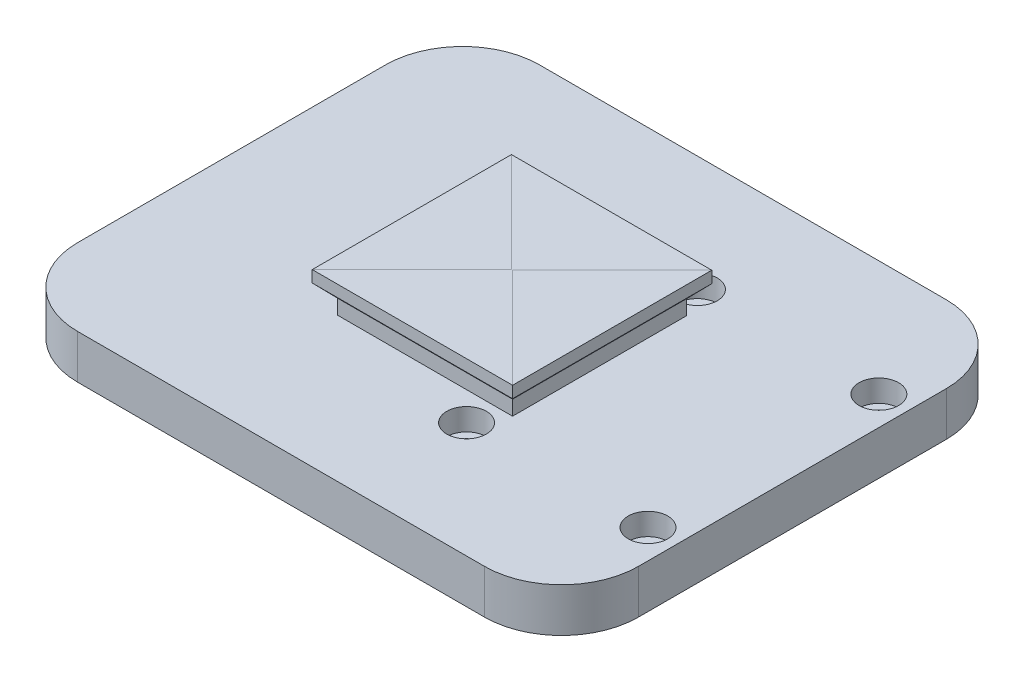
ISO-10303-21;
HEADER;
FILE_DESCRIPTION(('STEP AP214'),'2;1');
FILE_NAME('part.step','',(''),(''),'','','');
FILE_SCHEMA(('AUTOMOTIVE_DESIGN { 1 0 10303 214 1 1 1 1 }'));
ENDSEC;
DATA;
#1=APPLICATION_CONTEXT('core data for automotive mechanical design processes');
#2=APPLICATION_PROTOCOL_DEFINITION('international standard','automotive_design',2000,#1);
#3=PRODUCT_CONTEXT('',#1,'mechanical');
#4=PRODUCT('Part','Part','',(#3));
#5=PRODUCT_RELATED_PRODUCT_CATEGORY('part','',(#4));
#6=PRODUCT_DEFINITION_FORMATION('','',#4);
#7=PRODUCT_DEFINITION_CONTEXT('part definition',#1,'design');
#8=PRODUCT_DEFINITION('design','',#6,#7);
#9=PRODUCT_DEFINITION_SHAPE('','',#8);
#10=(LENGTH_UNIT() NAMED_UNIT(*) SI_UNIT(.MILLI.,.METRE.));
#11=(NAMED_UNIT(*) PLANE_ANGLE_UNIT() SI_UNIT($,.RADIAN.));
#12=(NAMED_UNIT(*) SI_UNIT($,.STERADIAN.) SOLID_ANGLE_UNIT());
#13=UNCERTAINTY_MEASURE_WITH_UNIT(LENGTH_MEASURE(1.E-05),#10,'distance_accuracy_value','');
#14=(GEOMETRIC_REPRESENTATION_CONTEXT(3) GLOBAL_UNCERTAINTY_ASSIGNED_CONTEXT((#13)) GLOBAL_UNIT_ASSIGNED_CONTEXT((#10,
#11,#12)) REPRESENTATION_CONTEXT('',''));
#15=CARTESIAN_POINT('',(0.,0.,0.));
#16=DIRECTION('',(0.,0.,1.));
#17=DIRECTION('',(1.,0.,0.));
#18=AXIS2_PLACEMENT_3D('',#15,#16,#17);
#19=CARTESIAN_POINT('',(18.5,0.2,14.));
#20=DIRECTION('',(0.,-1.,0.));
#21=DIRECTION('',(1.,0.,0.));
#22=AXIS2_PLACEMENT_3D('',#19,#20,#21);
#23=CYLINDRICAL_SURFACE('',#22,7.);
#24=CARTESIAN_POINT('',(18.5,-3.8,14.));
#25=DIRECTION('',(0.,1.,0.));
#26=DIRECTION('',(-1.,0.,0.));
#27=AXIS2_PLACEMENT_3D('',#24,#25,#26);
#28=CIRCLE('',#27,7.);
#29=CARTESIAN_POINT('',(18.5,-3.8,21.));
#30=VERTEX_POINT('',#29);
#31=CARTESIAN_POINT('',(25.5,-3.8,14.));
#32=VERTEX_POINT('',#31);
#33=EDGE_CURVE('E256',#30,#32,#28,.T.);
#34=ORIENTED_EDGE('',*,*,#33,.T.);
#35=DIRECTION('',(0.,-1.,0.));
#36=VECTOR('',#35,1.);
#37=CARTESIAN_POINT('',(25.5,0.2,14.));
#38=LINE('',#37,#36);
#39=CARTESIAN_POINT('',(25.5,0.2,14.));
#40=VERTEX_POINT('',#39);
#41=EDGE_CURVE('E421',#40,#32,#38,.T.);
#42=ORIENTED_EDGE('',*,*,#41,.F.);
#43=CARTESIAN_POINT('',(18.5,0.2,14.));
#44=DIRECTION('',(0.,1.,0.));
#45=DIRECTION('',(-1.,0.,0.));
#46=AXIS2_PLACEMENT_3D('',#43,#44,#45);
#47=CIRCLE('',#46,7.);
#48=CARTESIAN_POINT('',(18.5,0.2,21.));
#49=VERTEX_POINT('',#48);
#50=EDGE_CURVE('E272',#49,#40,#47,.T.);
#51=ORIENTED_EDGE('',*,*,#50,.F.);
#52=DIRECTION('',(0.,-1.,0.));
#53=VECTOR('',#52,1.);
#54=CARTESIAN_POINT('',(18.5,0.2,21.));
#55=LINE('',#54,#53);
#56=EDGE_CURVE('E403',#49,#30,#55,.T.);
#57=ORIENTED_EDGE('',*,*,#56,.T.);
#58=EDGE_LOOP('',(#34,#42,#51,#57));
#59=FACE_BOUND('',#58,.T.);
#60=ADVANCED_FACE('F15',(#59),#23,.T.);
#61=CARTESIAN_POINT('',(7.95,1.540402622584,-9.274709182745));
#62=DIRECTION('',(-0.719339800338818,0.694658370458825,0.));
#63=DIRECTION('',(0.,0.,1.));
#64=AXIS2_PLACEMENT_3D('',#61,#62,#63);
#65=PLANE('',#64);
#66=DIRECTION('',(-0.570514335805256,-0.590784889178265,0.570514335805256));
#67=VECTOR('',#66,1.);
#68=CARTESIAN_POINT('',(9.108826529768,2.740402622584,-9.058826529768));
#69=LINE('',#68,#67);
#70=CARTESIAN_POINT('',(9.108826529768,2.740402622584,-9.058826529768));
#71=VERTEX_POINT('',#70);
#72=CARTESIAN_POINT('',(7.95,1.540402622584,-7.9));
#73=VERTEX_POINT('',#72);
#74=EDGE_CURVE('E396',#71,#73,#69,.T.);
#75=ORIENTED_EDGE('',*,*,#74,.F.);
#76=DIRECTION('',(0.,0.,1.));
#77=VECTOR('',#76,1.);
#78=CARTESIAN_POINT('',(9.108826529768,2.740402622584,-9.058826529768));
#79=LINE('',#78,#77);
#80=CARTESIAN_POINT('',(9.108826529768,2.740402622584,9.058826529768));
#81=VERTEX_POINT('',#80);
#82=EDGE_CURVE('E9',#71,#81,#79,.T.);
#83=ORIENTED_EDGE('',*,*,#82,.T.);
#84=DIRECTION('',(-0.570514335805256,-0.590784889178265,-0.570514335805256));
#85=VECTOR('',#84,1.);
#86=CARTESIAN_POINT('',(9.108826529768,2.740402622584,9.058826529768));
#87=LINE('',#86,#85);
#88=CARTESIAN_POINT('',(7.95,1.540402622584,7.9));
#89=VERTEX_POINT('',#88);
#90=EDGE_CURVE('E417',#81,#89,#87,.T.);
#91=ORIENTED_EDGE('',*,*,#90,.T.);
#92=DIRECTION('',(0.,0.,1.));
#93=VECTOR('',#92,1.);
#94=CARTESIAN_POINT('',(7.95,1.540402622584,-7.9));
#95=LINE('',#94,#93);
#96=EDGE_CURVE('E43',#73,#89,#95,.T.);
#97=ORIENTED_EDGE('',*,*,#96,.F.);
#98=EDGE_LOOP('',(#75,#83,#91,#97));
#99=FACE_BOUND('',#98,.T.);
#100=ADVANCED_FACE('F584',(#99),#65,.F.);
#101=CARTESIAN_POINT('',(9.108826529768,2.740402622584,-9.274709182745));
#102=DIRECTION('',(-1.,0.,0.));
#103=DIRECTION('',(0.,0.,1.));
#104=AXIS2_PLACEMENT_3D('',#101,#102,#103);
#105=PLANE('',#104);
#106=DIRECTION('',(0.,-1.,0.));
#107=VECTOR('',#106,1.);
#108=CARTESIAN_POINT('',(9.108826529768,3.8,-9.058826529768));
#109=LINE('',#108,#107);
#110=CARTESIAN_POINT('',(9.108826529768,3.8,-9.058826529768));
#111=VERTEX_POINT('',#110);
#112=EDGE_CURVE('E393',#111,#71,#109,.T.);
#113=ORIENTED_EDGE('',*,*,#112,.F.);
#114=DIRECTION('',(0.,0.,1.));
#115=VECTOR('',#114,1.);
#116=CARTESIAN_POINT('',(9.108826529768,3.8,-9.058826529768));
#117=LINE('',#116,#115);
#118=CARTESIAN_POINT('',(9.108826529768,3.8,9.058826529768));
#119=VERTEX_POINT('',#118);
#120=EDGE_CURVE('E23',#111,#119,#117,.T.);
#121=ORIENTED_EDGE('',*,*,#120,.T.);
#122=DIRECTION('',(0.,-1.,0.));
#123=VECTOR('',#122,1.);
#124=CARTESIAN_POINT('',(9.108826529768,3.8,9.058826529768));
#125=LINE('',#124,#123);
#126=EDGE_CURVE('E352',#119,#81,#125,.T.);
#127=ORIENTED_EDGE('',*,*,#126,.T.);
#128=ORIENTED_EDGE('',*,*,#82,.F.);
#129=EDGE_LOOP('',(#113,#121,#127,#128));
#130=FACE_BOUND('',#129,.T.);
#131=ADVANCED_FACE('F583',(#130),#105,.F.);
#132=CARTESIAN_POINT('',(9.108826529768,3.8,-9.274709182745));
#133=DIRECTION('',(0.,-1.,0.));
#134=DIRECTION('',(0.,0.,-1.));
#135=AXIS2_PLACEMENT_3D('',#132,#133,#134);
#136=PLANE('',#135);
#137=DIRECTION('',(0.707106781186548,0.,-0.707106781186548));
#138=VECTOR('',#137,1.);
#139=CARTESIAN_POINT('',(0.05,3.8,0.));
#140=LINE('',#139,#138);
#141=CARTESIAN_POINT('',(0.05,3.8,0.));
#142=VERTEX_POINT('',#141);
#143=EDGE_CURVE('E390',#142,#111,#140,.T.);
#144=ORIENTED_EDGE('',*,*,#143,.F.);
#145=DIRECTION('',(0.707106781186548,0.,0.707106781186548));
#146=VECTOR('',#145,1.);
#147=CARTESIAN_POINT('',(0.05,3.8,0.));
#148=LINE('',#147,#146);
#149=EDGE_CURVE('E382',#142,#119,#148,.T.);
#150=ORIENTED_EDGE('',*,*,#149,.T.);
#151=ORIENTED_EDGE('',*,*,#120,.F.);
#152=EDGE_LOOP('',(#144,#150,#151));
#153=FACE_BOUND('',#152,.T.);
#154=ADVANCED_FACE('F571',(#153),#136,.F.);
#155=CARTESIAN_POINT('',(7.95,0.2,-9.274709182745));
#156=DIRECTION('',(-1.,0.,0.));
#157=DIRECTION('',(0.,0.,1.));
#158=AXIS2_PLACEMENT_3D('',#155,#156,#157);
#159=PLANE('',#158);
#160=DIRECTION('',(0.,-1.,0.));
#161=VECTOR('',#160,1.);
#162=CARTESIAN_POINT('',(7.95,1.540402622584,-7.9));
#163=LINE('',#162,#161);
#164=CARTESIAN_POINT('',(7.95,0.2,-7.9));
#165=VERTEX_POINT('',#164);
#166=EDGE_CURVE('E309',#73,#165,#163,.T.);
#167=ORIENTED_EDGE('',*,*,#166,.F.);
#168=ORIENTED_EDGE('',*,*,#96,.T.);
#169=DIRECTION('',(0.,-1.,0.));
#170=VECTOR('',#169,1.);
#171=CARTESIAN_POINT('',(7.95,1.540402622584,7.9));
#172=LINE('',#171,#170);
#173=CARTESIAN_POINT('',(7.95,0.2,7.9));
#174=VERTEX_POINT('',#173);
#175=EDGE_CURVE('E353',#89,#174,#172,.T.);
#176=ORIENTED_EDGE('',*,*,#175,.T.);
#177=DIRECTION('',(0.,0.,1.));
#178=VECTOR('',#177,1.);
#179=CARTESIAN_POINT('',(7.95,0.2,-7.9));
#180=LINE('',#179,#178);
#181=EDGE_CURVE('E294',#165,#174,#180,.T.);
#182=ORIENTED_EDGE('',*,*,#181,.F.);
#183=EDGE_LOOP('',(#167,#168,#176,#182));
#184=FACE_BOUND('',#183,.T.);
#185=ADVANCED_FACE('F568',(#184),#159,.F.);
#186=CARTESIAN_POINT('',(25.5,0.2,0.));
#187=DIRECTION('',(-1.,0.,0.));
#188=DIRECTION('',(0.,0.,1.));
#189=AXIS2_PLACEMENT_3D('',#186,#187,#188);
#190=PLANE('',#189);
#191=DIRECTION('',(0.,0.,1.));
#192=VECTOR('',#191,1.);
#193=CARTESIAN_POINT('',(25.5,-3.8,-14.));
#194=LINE('',#193,#192);
#195=CARTESIAN_POINT('',(25.5,-3.8,-14.));
#196=VERTEX_POINT('',#195);
#197=EDGE_CURVE('E255',#196,#32,#194,.T.);
#198=ORIENTED_EDGE('',*,*,#197,.F.);
#199=DIRECTION('',(0.,-1.,0.));
#200=VECTOR('',#199,1.);
#201=CARTESIAN_POINT('',(25.5,0.2,-14.));
#202=LINE('',#201,#200);
#203=CARTESIAN_POINT('',(25.5,0.2,-14.));
#204=VERTEX_POINT('',#203);
#205=EDGE_CURVE('E419',#204,#196,#202,.T.);
#206=ORIENTED_EDGE('',*,*,#205,.F.);
#207=DIRECTION('',(0.,0.,1.));
#208=VECTOR('',#207,1.);
#209=CARTESIAN_POINT('',(25.5,0.2,-14.));
#210=LINE('',#209,#208);
#211=EDGE_CURVE('E280',#204,#40,#210,.T.);
#212=ORIENTED_EDGE('',*,*,#211,.T.);
#213=ORIENTED_EDGE('',*,*,#41,.T.);
#214=EDGE_LOOP('',(#198,#206,#212,#213));
#215=FACE_BOUND('',#214,.T.);
#216=ADVANCED_FACE('F569',(#215),#190,.F.);
#217=CARTESIAN_POINT('',(18.5,0.2,-14.));
#218=DIRECTION('',(0.,-1.,0.));
#219=DIRECTION('',(1.,0.,0.));
#220=AXIS2_PLACEMENT_3D('',#217,#218,#219);
#221=CYLINDRICAL_SURFACE('',#220,7.);
#222=CARTESIAN_POINT('',(18.5,-3.8,-14.));
#223=DIRECTION('',(0.,-1.,0.));
#224=DIRECTION('',(-1.,0.,0.));
#225=AXIS2_PLACEMENT_3D('',#222,#223,#224);
#226=CIRCLE('',#225,7.);
#227=CARTESIAN_POINT('',(18.5,-3.8,-21.));
#228=VERTEX_POINT('',#227);
#229=EDGE_CURVE('E259',#228,#196,#226,.T.);
#230=ORIENTED_EDGE('',*,*,#229,.F.);
#231=DIRECTION('',(0.,-1.,0.));
#232=VECTOR('',#231,1.);
#233=CARTESIAN_POINT('',(18.5,0.2,-21.));
#234=LINE('',#233,#232);
#235=CARTESIAN_POINT('',(18.5,0.2,-21.));
#236=VERTEX_POINT('',#235);
#237=EDGE_CURVE('E337',#236,#228,#234,.T.);
#238=ORIENTED_EDGE('',*,*,#237,.F.);
#239=CARTESIAN_POINT('',(18.5,0.2,-14.));
#240=DIRECTION('',(0.,-1.,0.));
#241=DIRECTION('',(-1.,0.,0.));
#242=AXIS2_PLACEMENT_3D('',#239,#240,#241);
#243=CIRCLE('',#242,7.);
#244=EDGE_CURVE('E241',#236,#204,#243,.T.);
#245=ORIENTED_EDGE('',*,*,#244,.T.);
#246=ORIENTED_EDGE('',*,*,#205,.T.);
#247=EDGE_LOOP('',(#230,#238,#245,#246));
#248=FACE_BOUND('',#247,.T.);
#249=ADVANCED_FACE('F578',(#248),#221,.T.);
#250=CARTESIAN_POINT('',(0.,1.540402622584,7.9));
#251=DIRECTION('',(0.,0.694658370458825,-0.719339800338818));
#252=DIRECTION('',(-1.,0.,0.));
#253=AXIS2_PLACEMENT_3D('',#250,#251,#252);
#254=PLANE('',#253);
#255=DIRECTION('',(-1.,0.,0.));
#256=VECTOR('',#255,1.);
#257=CARTESIAN_POINT('',(9.108826529768,2.740402622584,9.058826529768));
#258=LINE('',#257,#256);
#259=CARTESIAN_POINT('',(-9.108826529768,2.740402622584,9.058826529768));
#260=VERTEX_POINT('',#259);
#261=EDGE_CURVE('E349',#81,#260,#258,.T.);
#262=ORIENTED_EDGE('',*,*,#261,.T.);
#263=DIRECTION('',(0.570514335805256,-0.590784889178265,-0.570514335805256));
#264=VECTOR('',#263,1.);
#265=CARTESIAN_POINT('',(-9.108826529768,2.740402622584,9.058826529768));
#266=LINE('',#265,#264);
#267=CARTESIAN_POINT('',(-7.95,1.540402622584,7.9));
#268=VERTEX_POINT('',#267);
#269=EDGE_CURVE('E313',#260,#268,#266,.T.);
#270=ORIENTED_EDGE('',*,*,#269,.T.);
#271=DIRECTION('',(-1.,0.,0.));
#272=VECTOR('',#271,1.);
#273=CARTESIAN_POINT('',(7.95,1.540402622584,7.9));
#274=LINE('',#273,#272);
#275=EDGE_CURVE('E408',#89,#268,#274,.T.);
#276=ORIENTED_EDGE('',*,*,#275,.F.);
#277=ORIENTED_EDGE('',*,*,#90,.F.);
#278=EDGE_LOOP('',(#262,#270,#276,#277));
#279=FACE_BOUND('',#278,.T.);
#280=ADVANCED_FACE('F551',(#279),#254,.F.);
#281=CARTESIAN_POINT('',(0.,2.740402622584,9.058826529768));
#282=DIRECTION('',(0.,0.,-1.));
#283=DIRECTION('',(0.,-1.,0.));
#284=AXIS2_PLACEMENT_3D('',#281,#282,#283);
#285=PLANE('',#284);
#286=DIRECTION('',(-1.,0.,0.));
#287=VECTOR('',#286,1.);
#288=CARTESIAN_POINT('',(9.108826529768,3.8,9.058826529768));
#289=LINE('',#288,#287);
#290=CARTESIAN_POINT('',(-9.108826529768,3.8,9.058826529768));
#291=VERTEX_POINT('',#290);
#292=EDGE_CURVE('E379',#119,#291,#289,.T.);
#293=ORIENTED_EDGE('',*,*,#292,.T.);
#294=DIRECTION('',(0.,-1.,0.));
#295=VECTOR('',#294,1.);
#296=CARTESIAN_POINT('',(-9.108826529768,3.8,9.058826529768));
#297=LINE('',#296,#295);
#298=EDGE_CURVE('E373',#291,#260,#297,.T.);
#299=ORIENTED_EDGE('',*,*,#298,.T.);
#300=ORIENTED_EDGE('',*,*,#261,.F.);
#301=ORIENTED_EDGE('',*,*,#126,.F.);
#302=EDGE_LOOP('',(#293,#299,#300,#301));
#303=FACE_BOUND('',#302,.T.);
#304=ADVANCED_FACE('F559',(#303),#285,.F.);
#305=CARTESIAN_POINT('',(0.,0.2,7.9));
#306=DIRECTION('',(0.,0.,-1.));
#307=DIRECTION('',(0.,-1.,0.));
#308=AXIS2_PLACEMENT_3D('',#305,#306,#307);
#309=PLANE('',#308);
#310=ORIENTED_EDGE('',*,*,#275,.T.);
#311=DIRECTION('',(0.,-1.,0.));
#312=VECTOR('',#311,1.);
#313=CARTESIAN_POINT('',(-7.95,1.540402622584,7.9));
#314=LINE('',#313,#312);
#315=CARTESIAN_POINT('',(-7.95,0.2,7.9));
#316=VERTEX_POINT('',#315);
#317=EDGE_CURVE('E346',#268,#316,#314,.T.);
#318=ORIENTED_EDGE('',*,*,#317,.T.);
#319=DIRECTION('',(-1.,0.,0.));
#320=VECTOR('',#319,1.);
#321=CARTESIAN_POINT('',(7.95,0.2,7.9));
#322=LINE('',#321,#320);
#323=EDGE_CURVE('E298',#174,#316,#322,.T.);
#324=ORIENTED_EDGE('',*,*,#323,.F.);
#325=ORIENTED_EDGE('',*,*,#175,.F.);
#326=EDGE_LOOP('',(#310,#318,#324,#325));
#327=FACE_BOUND('',#326,.T.);
#328=ADVANCED_FACE('F552',(#327),#309,.F.);
#329=CARTESIAN_POINT('',(-18.5,0.2,14.));
#330=DIRECTION('',(0.,-1.,0.));
#331=DIRECTION('',(-1.,0.,0.));
#332=AXIS2_PLACEMENT_3D('',#329,#330,#331);
#333=CYLINDRICAL_SURFACE('',#332,7.);
#334=CARTESIAN_POINT('',(-18.5,-3.8,14.));
#335=DIRECTION('',(0.,-1.,0.));
#336=DIRECTION('',(1.,0.,0.));
#337=AXIS2_PLACEMENT_3D('',#334,#335,#336);
#338=CIRCLE('',#337,7.);
#339=CARTESIAN_POINT('',(-18.5,-3.8,21.));
#340=VERTEX_POINT('',#339);
#341=CARTESIAN_POINT('',(-25.5,-3.8,14.));
#342=VERTEX_POINT('',#341);
#343=EDGE_CURVE('E325',#340,#342,#338,.T.);
#344=ORIENTED_EDGE('',*,*,#343,.F.);
#345=DIRECTION('',(0.,-1.,0.));
#346=VECTOR('',#345,1.);
#347=CARTESIAN_POINT('',(-18.5,0.2,21.));
#348=LINE('',#347,#346);
#349=CARTESIAN_POINT('',(-18.5,0.2,21.));
#350=VERTEX_POINT('',#349);
#351=EDGE_CURVE('E406',#350,#340,#348,.T.);
#352=ORIENTED_EDGE('',*,*,#351,.F.);
#353=CARTESIAN_POINT('',(-18.5,0.2,14.));
#354=DIRECTION('',(0.,-1.,0.));
#355=DIRECTION('',(1.,0.,0.));
#356=AXIS2_PLACEMENT_3D('',#353,#354,#355);
#357=CIRCLE('',#356,7.);
#358=CARTESIAN_POINT('',(-25.5,0.2,14.));
#359=VERTEX_POINT('',#358);
#360=EDGE_CURVE('E268',#350,#359,#357,.T.);
#361=ORIENTED_EDGE('',*,*,#360,.T.);
#362=DIRECTION('',(0.,-1.,0.));
#363=VECTOR('',#362,1.);
#364=CARTESIAN_POINT('',(-25.5,0.2,14.));
#365=LINE('',#364,#363);
#366=EDGE_CURVE('E344',#359,#342,#365,.T.);
#367=ORIENTED_EDGE('',*,*,#366,.T.);
#368=EDGE_LOOP('',(#344,#352,#361,#367));
#369=FACE_BOUND('',#368,.T.);
#370=ADVANCED_FACE('F606',(#369),#333,.T.);
#371=CARTESIAN_POINT('',(0.,0.2,21.));
#372=DIRECTION('',(0.,0.,-1.));
#373=DIRECTION('',(0.,-1.,0.));
#374=AXIS2_PLACEMENT_3D('',#371,#372,#373);
#375=PLANE('',#374);
#376=DIRECTION('',(-1.,0.,0.));
#377=VECTOR('',#376,1.);
#378=CARTESIAN_POINT('',(18.5,-3.8,21.));
#379=LINE('',#378,#377);
#380=EDGE_CURVE('E318',#30,#340,#379,.T.);
#381=ORIENTED_EDGE('',*,*,#380,.F.);
#382=ORIENTED_EDGE('',*,*,#56,.F.);
#383=DIRECTION('',(-1.,0.,0.));
#384=VECTOR('',#383,1.);
#385=CARTESIAN_POINT('',(18.5,0.2,21.));
#386=LINE('',#385,#384);
#387=EDGE_CURVE('E267',#49,#350,#386,.T.);
#388=ORIENTED_EDGE('',*,*,#387,.T.);
#389=ORIENTED_EDGE('',*,*,#351,.T.);
#390=EDGE_LOOP('',(#381,#382,#388,#389));
#391=FACE_BOUND('',#390,.T.);
#392=ADVANCED_FACE('F603',(#391),#375,.F.);
#393=CARTESIAN_POINT('',(0.,1.540402622584,-7.9));
#394=DIRECTION('',(0.,0.694658370458825,0.719339800338818));
#395=DIRECTION('',(1.,0.,0.));
#396=AXIS2_PLACEMENT_3D('',#393,#394,#395);
#397=PLANE('',#396);
#398=DIRECTION('',(-1.,0.,0.));
#399=VECTOR('',#398,1.);
#400=CARTESIAN_POINT('',(9.108826529768,2.740402622584,-9.058826529768));
#401=LINE('',#400,#399);
#402=CARTESIAN_POINT('',(-9.108826529768,2.740402622584,-9.058826529768));
#403=VERTEX_POINT('',#402);
#404=EDGE_CURVE('E399',#71,#403,#401,.T.);
#405=ORIENTED_EDGE('',*,*,#404,.F.);
#406=ORIENTED_EDGE('',*,*,#74,.T.);
#407=DIRECTION('',(-1.,0.,0.));
#408=VECTOR('',#407,1.);
#409=CARTESIAN_POINT('',(7.95,1.540402622584,-7.9));
#410=LINE('',#409,#408);
#411=CARTESIAN_POINT('',(-7.95,1.540402622584,-7.9));
#412=VERTEX_POINT('',#411);
#413=EDGE_CURVE('E307',#73,#412,#410,.T.);
#414=ORIENTED_EDGE('',*,*,#413,.T.);
#415=DIRECTION('',(0.570514335805256,-0.590784889178265,0.570514335805256));
#416=VECTOR('',#415,1.);
#417=CARTESIAN_POINT('',(-9.108826529768,2.740402622584,-9.058826529768));
#418=LINE('',#417,#416);
#419=EDGE_CURVE('E380',#403,#412,#418,.T.);
#420=ORIENTED_EDGE('',*,*,#419,.F.);
#421=EDGE_LOOP('',(#405,#406,#414,#420));
#422=FACE_BOUND('',#421,.T.);
#423=ADVANCED_FACE('F566',(#422),#397,.F.);
#424=CARTESIAN_POINT('',(0.,2.740402622584,-9.058826529768));
#425=DIRECTION('',(0.,0.,1.));
#426=DIRECTION('',(1.,0.,0.));
#427=AXIS2_PLACEMENT_3D('',#424,#425,#426);
#428=PLANE('',#427);
#429=DIRECTION('',(-1.,0.,0.));
#430=VECTOR('',#429,1.);
#431=CARTESIAN_POINT('',(9.108826529768,3.8,-9.058826529768));
#432=LINE('',#431,#430);
#433=CARTESIAN_POINT('',(-9.108826529768,3.8,-9.058826529768));
#434=VERTEX_POINT('',#433);
#435=EDGE_CURVE('E391',#111,#434,#432,.T.);
#436=ORIENTED_EDGE('',*,*,#435,.F.);
#437=ORIENTED_EDGE('',*,*,#112,.T.);
#438=ORIENTED_EDGE('',*,*,#404,.T.);
#439=DIRECTION('',(0.,-1.,0.));
#440=VECTOR('',#439,1.);
#441=CARTESIAN_POINT('',(-9.108826529768,3.8,-9.058826529768));
#442=LINE('',#441,#440);
#443=EDGE_CURVE('E364',#434,#403,#442,.T.);
#444=ORIENTED_EDGE('',*,*,#443,.F.);
#445=EDGE_LOOP('',(#436,#437,#438,#444));
#446=FACE_BOUND('',#445,.T.);
#447=ADVANCED_FACE('F570',(#446),#428,.F.);
#448=CARTESIAN_POINT('',(0.,3.8,-9.058826529768));
#449=DIRECTION('',(0.,-1.,0.));
#450=DIRECTION('',(0.,0.,-1.));
#451=AXIS2_PLACEMENT_3D('',#448,#449,#450);
#452=PLANE('',#451);
#453=DIRECTION('',(-0.707106781186548,0.,-0.707106781186548));
#454=VECTOR('',#453,1.);
#455=CARTESIAN_POINT('',(-0.05,3.8,0.));
#456=LINE('',#455,#454);
#457=CARTESIAN_POINT('',(-0.05,3.8,0.));
#458=VERTEX_POINT('',#457);
#459=EDGE_CURVE('E282',#458,#434,#456,.T.);
#460=ORIENTED_EDGE('',*,*,#459,.F.);
#461=DIRECTION('',(-0.707106781186548,0.,0.707106781186548));
#462=VECTOR('',#461,1.);
#463=CARTESIAN_POINT('',(-0.05,3.8,0.));
#464=LINE('',#463,#462);
#465=EDGE_CURVE('E363',#458,#291,#464,.T.);
#466=ORIENTED_EDGE('',*,*,#465,.T.);
#467=ORIENTED_EDGE('',*,*,#292,.F.);
#468=ORIENTED_EDGE('',*,*,#149,.F.);
#469=ORIENTED_EDGE('',*,*,#143,.T.);
#470=ORIENTED_EDGE('',*,*,#435,.T.);
#471=EDGE_LOOP('',(#460,#466,#467,#468,#469,#470));
#472=FACE_BOUND('',#471,.T.);
#473=ADVANCED_FACE('F676',(#472),#452,.F.);
#474=CARTESIAN_POINT('',(0.,0.2,-7.9));
#475=DIRECTION('',(0.,0.,1.));
#476=DIRECTION('',(1.,0.,0.));
#477=AXIS2_PLACEMENT_3D('',#474,#475,#476);
#478=PLANE('',#477);
#479=ORIENTED_EDGE('',*,*,#413,.F.);
#480=ORIENTED_EDGE('',*,*,#166,.T.);
#481=DIRECTION('',(-1.,0.,0.));
#482=VECTOR('',#481,1.);
#483=CARTESIAN_POINT('',(7.95,0.2,-7.9));
#484=LINE('',#483,#482);
#485=CARTESIAN_POINT('',(-7.95,0.2,-7.9));
#486=VERTEX_POINT('',#485);
#487=EDGE_CURVE('E295',#165,#486,#484,.T.);
#488=ORIENTED_EDGE('',*,*,#487,.T.);
#489=DIRECTION('',(0.,-1.,0.));
#490=VECTOR('',#489,1.);
#491=CARTESIAN_POINT('',(-7.95,1.540402622584,-7.9));
#492=LINE('',#491,#490);
#493=EDGE_CURVE('E350',#412,#486,#492,.T.);
#494=ORIENTED_EDGE('',*,*,#493,.F.);
#495=EDGE_LOOP('',(#479,#480,#488,#494));
#496=FACE_BOUND('',#495,.T.);
#497=ADVANCED_FACE('F543',(#496),#478,.F.);
#498=CARTESIAN_POINT('',(-7.95,1.540402622584,-9.274709182745));
#499=DIRECTION('',(0.719339800338818,0.694658370458825,0.));
#500=DIRECTION('',(0.,0.,-1.));
#501=AXIS2_PLACEMENT_3D('',#498,#499,#500);
#502=PLANE('',#501);
#503=ORIENTED_EDGE('',*,*,#419,.T.);
#504=DIRECTION('',(0.,0.,1.));
#505=VECTOR('',#504,1.);
#506=CARTESIAN_POINT('',(-7.95,1.540402622584,-7.9));
#507=LINE('',#506,#505);
#508=EDGE_CURVE('E290',#412,#268,#507,.T.);
#509=ORIENTED_EDGE('',*,*,#508,.T.);
#510=ORIENTED_EDGE('',*,*,#269,.F.);
#511=DIRECTION('',(0.,0.,1.));
#512=VECTOR('',#511,1.);
#513=CARTESIAN_POINT('',(-9.108826529768,2.740402622584,-9.058826529768));
#514=LINE('',#513,#512);
#515=EDGE_CURVE('E369',#403,#260,#514,.T.);
#516=ORIENTED_EDGE('',*,*,#515,.F.);
#517=EDGE_LOOP('',(#503,#509,#510,#516));
#518=FACE_BOUND('',#517,.T.);
#519=ADVANCED_FACE('F531',(#518),#502,.F.);
#520=CARTESIAN_POINT('',(-9.108826529768,2.740402622584,-9.274709182745));
#521=DIRECTION('',(1.,0.,0.));
#522=DIRECTION('',(0.,0.,-1.));
#523=AXIS2_PLACEMENT_3D('',#520,#521,#522);
#524=PLANE('',#523);
#525=ORIENTED_EDGE('',*,*,#443,.T.);
#526=ORIENTED_EDGE('',*,*,#515,.T.);
#527=ORIENTED_EDGE('',*,*,#298,.F.);
#528=DIRECTION('',(0.,0.,1.));
#529=VECTOR('',#528,1.);
#530=CARTESIAN_POINT('',(-9.108826529768,3.8,-9.058826529768));
#531=LINE('',#530,#529);
#532=EDGE_CURVE('E287',#434,#291,#531,.T.);
#533=ORIENTED_EDGE('',*,*,#532,.F.);
#534=EDGE_LOOP('',(#525,#526,#527,#533));
#535=FACE_BOUND('',#534,.T.);
#536=ADVANCED_FACE('F565',(#535),#524,.F.);
#537=CARTESIAN_POINT('',(-9.108826529768,3.8,-9.274709182745));
#538=DIRECTION('',(0.,-1.,0.));
#539=DIRECTION('',(0.,0.,-1.));
#540=AXIS2_PLACEMENT_3D('',#537,#538,#539);
#541=PLANE('',#540);
#542=ORIENTED_EDGE('',*,*,#459,.T.);
#543=ORIENTED_EDGE('',*,*,#532,.T.);
#544=ORIENTED_EDGE('',*,*,#465,.F.);
#545=EDGE_LOOP('',(#542,#543,#544));
#546=FACE_BOUND('',#545,.T.);
#547=ADVANCED_FACE('F667',(#546),#541,.F.);
#548=CARTESIAN_POINT('',(-7.95,0.2,-9.274709182745));
#549=DIRECTION('',(1.,0.,0.));
#550=DIRECTION('',(0.,0.,-1.));
#551=AXIS2_PLACEMENT_3D('',#548,#549,#550);
#552=PLANE('',#551);
#553=ORIENTED_EDGE('',*,*,#493,.T.);
#554=DIRECTION('',(0.,0.,1.));
#555=VECTOR('',#554,1.);
#556=CARTESIAN_POINT('',(-7.95,0.2,-7.9));
#557=LINE('',#556,#555);
#558=EDGE_CURVE('E281',#486,#316,#557,.T.);
#559=ORIENTED_EDGE('',*,*,#558,.T.);
#560=ORIENTED_EDGE('',*,*,#317,.F.);
#561=ORIENTED_EDGE('',*,*,#508,.F.);
#562=EDGE_LOOP('',(#553,#559,#560,#561));
#563=FACE_BOUND('',#562,.T.);
#564=ADVANCED_FACE('F539',(#563),#552,.F.);
#565=CARTESIAN_POINT('',(-25.5,0.2,0.));
#566=DIRECTION('',(1.,0.,0.));
#567=DIRECTION('',(0.,1.,0.));
#568=AXIS2_PLACEMENT_3D('',#565,#566,#567);
#569=PLANE('',#568);
#570=DIRECTION('',(0.,0.,1.));
#571=VECTOR('',#570,1.);
#572=CARTESIAN_POINT('',(-25.5,-3.8,-14.));
#573=LINE('',#572,#571);
#574=CARTESIAN_POINT('',(-25.5,-3.8,-14.));
#575=VERTEX_POINT('',#574);
#576=EDGE_CURVE('E326',#575,#342,#573,.T.);
#577=ORIENTED_EDGE('',*,*,#576,.T.);
#578=ORIENTED_EDGE('',*,*,#366,.F.);
#579=DIRECTION('',(0.,0.,1.));
#580=VECTOR('',#579,1.);
#581=CARTESIAN_POINT('',(-25.5,0.2,-14.));
#582=LINE('',#581,#580);
#583=CARTESIAN_POINT('',(-25.5,0.2,-14.));
#584=VERTEX_POINT('',#583);
#585=EDGE_CURVE('E262',#584,#359,#582,.T.);
#586=ORIENTED_EDGE('',*,*,#585,.F.);
#587=DIRECTION('',(0.,-1.,0.));
#588=VECTOR('',#587,1.);
#589=CARTESIAN_POINT('',(-25.5,0.2,-14.));
#590=LINE('',#589,#588);
#591=EDGE_CURVE('E340',#584,#575,#590,.T.);
#592=ORIENTED_EDGE('',*,*,#591,.T.);
#593=EDGE_LOOP('',(#577,#578,#586,#592));
#594=FACE_BOUND('',#593,.T.);
#595=ADVANCED_FACE('F612',(#594),#569,.F.);
#596=CARTESIAN_POINT('',(-18.5,0.2,-14.));
#597=DIRECTION('',(0.,-1.,0.));
#598=DIRECTION('',(-1.,0.,0.));
#599=AXIS2_PLACEMENT_3D('',#596,#597,#598);
#600=CYLINDRICAL_SURFACE('',#599,7.);
#601=CARTESIAN_POINT('',(-18.5,-3.8,-14.));
#602=DIRECTION('',(0.,1.,0.));
#603=DIRECTION('',(1.,0.,0.));
#604=AXIS2_PLACEMENT_3D('',#601,#602,#603);
#605=CIRCLE('',#604,7.);
#606=CARTESIAN_POINT('',(-18.5,-3.8,-21.));
#607=VERTEX_POINT('',#606);
#608=EDGE_CURVE('E329',#607,#575,#605,.T.);
#609=ORIENTED_EDGE('',*,*,#608,.T.);
#610=ORIENTED_EDGE('',*,*,#591,.F.);
#611=CARTESIAN_POINT('',(-18.5,0.2,-14.));
#612=DIRECTION('',(0.,1.,0.));
#613=DIRECTION('',(1.,0.,0.));
#614=AXIS2_PLACEMENT_3D('',#611,#612,#613);
#615=CIRCLE('',#614,7.);
#616=CARTESIAN_POINT('',(-18.5,0.2,-21.));
#617=VERTEX_POINT('',#616);
#618=EDGE_CURVE('E257',#617,#584,#615,.T.);
#619=ORIENTED_EDGE('',*,*,#618,.F.);
#620=DIRECTION('',(0.,-1.,0.));
#621=VECTOR('',#620,1.);
#622=CARTESIAN_POINT('',(-18.5,0.2,-21.));
#623=LINE('',#622,#621);
#624=EDGE_CURVE('E331',#617,#607,#623,.T.);
#625=ORIENTED_EDGE('',*,*,#624,.T.);
#626=EDGE_LOOP('',(#609,#610,#619,#625));
#627=FACE_BOUND('',#626,.T.);
#628=ADVANCED_FACE('F615',(#627),#600,.T.);
#629=CARTESIAN_POINT('',(0.,0.2,-21.));
#630=DIRECTION('',(0.,0.,1.));
#631=DIRECTION('',(1.,0.,0.));
#632=AXIS2_PLACEMENT_3D('',#629,#630,#631);
#633=PLANE('',#632);
#634=DIRECTION('',(-1.,0.,0.));
#635=VECTOR('',#634,1.);
#636=CARTESIAN_POINT('',(18.5,-3.8,-21.));
#637=LINE('',#636,#635);
#638=EDGE_CURVE('E303',#228,#607,#637,.T.);
#639=ORIENTED_EDGE('',*,*,#638,.T.);
#640=ORIENTED_EDGE('',*,*,#624,.F.);
#641=DIRECTION('',(-1.,0.,0.));
#642=VECTOR('',#641,1.);
#643=CARTESIAN_POINT('',(18.5,0.2,-21.));
#644=LINE('',#643,#642);
#645=EDGE_CURVE('E248',#236,#617,#644,.T.);
#646=ORIENTED_EDGE('',*,*,#645,.F.);
#647=ORIENTED_EDGE('',*,*,#237,.T.);
#648=EDGE_LOOP('',(#639,#640,#646,#647));
#649=FACE_BOUND('',#648,.T.);
#650=ADVANCED_FACE('F620',(#649),#633,.F.);
#651=CARTESIAN_POINT('',(-18.5,-3.8,-14.));
#652=DIRECTION('',(0.,1.,0.));
#653=DIRECTION('',(0.,0.,-1.));
#654=AXIS2_PLACEMENT_3D('',#651,#652,#653);
#655=PLANE('',#654);
#656=CARTESIAN_POINT('',(22.867117615526,-3.8,10.5));
#657=DIRECTION('',(0.,1.,0.));
#658=DIRECTION('',(1.,0.,0.));
#659=AXIS2_PLACEMENT_3D('',#656,#657,#658);
#660=CIRCLE('',#659,1.05);
#661=CARTESIAN_POINT('',(21.817117615526,-3.8,10.5));
#662=VERTEX_POINT('',#661);
#663=EDGE_CURVE('E513',#662,#662,#660,.T.);
#664=ORIENTED_EDGE('',*,*,#663,.T.);
#665=EDGE_LOOP('',(#664));
#666=FACE_BOUND('',#665,.T.);
#667=CARTESIAN_POINT('',(6.367117615526,-3.8,10.5));
#668=DIRECTION('',(0.,-1.,0.));
#669=DIRECTION('',(1.,0.,0.));
#670=AXIS2_PLACEMENT_3D('',#667,#668,#669);
#671=CIRCLE('',#670,1.05);
#672=CARTESIAN_POINT('',(5.317117615526,-3.8,10.5));
#673=VERTEX_POINT('',#672);
#674=EDGE_CURVE('E449',#673,#673,#671,.T.);
#675=ORIENTED_EDGE('',*,*,#674,.F.);
#676=EDGE_LOOP('',(#675));
#677=FACE_BOUND('',#676,.T.);
#678=CARTESIAN_POINT('',(6.367117615526,-3.8,-10.5));
#679=DIRECTION('',(0.,-1.,0.));
#680=DIRECTION('',(1.,0.,0.));
#681=AXIS2_PLACEMENT_3D('',#678,#679,#680);
#682=CIRCLE('',#681,1.05);
#683=CARTESIAN_POINT('',(5.317117615526,-3.8,-10.5));
#684=VERTEX_POINT('',#683);
#685=EDGE_CURVE('E483',#684,#684,#682,.T.);
#686=ORIENTED_EDGE('',*,*,#685,.F.);
#687=EDGE_LOOP('',(#686));
#688=FACE_BOUND('',#687,.T.);
#689=CARTESIAN_POINT('',(22.867117615526,-3.8,-10.5));
#690=DIRECTION('',(0.,-1.,0.));
#691=DIRECTION('',(1.,0.,0.));
#692=AXIS2_PLACEMENT_3D('',#689,#690,#691);
#693=CIRCLE('',#692,1.05);
#694=CARTESIAN_POINT('',(21.817117615526,-3.8,-10.5));
#695=VERTEX_POINT('',#694);
#696=EDGE_CURVE('E439',#695,#695,#693,.T.);
#697=ORIENTED_EDGE('',*,*,#696,.F.);
#698=EDGE_LOOP('',(#697));
#699=FACE_BOUND('',#698,.T.);
#700=ORIENTED_EDGE('',*,*,#638,.F.);
#701=ORIENTED_EDGE('',*,*,#229,.T.);
#702=ORIENTED_EDGE('',*,*,#197,.T.);
#703=ORIENTED_EDGE('',*,*,#33,.F.);
#704=ORIENTED_EDGE('',*,*,#380,.T.);
#705=ORIENTED_EDGE('',*,*,#343,.T.);
#706=ORIENTED_EDGE('',*,*,#576,.F.);
#707=ORIENTED_EDGE('',*,*,#608,.F.);
#708=EDGE_LOOP('',(#700,#701,#702,#703,#704,#705,#706,#707));
#709=FACE_BOUND('',#708,.T.);
#710=ADVANCED_FACE('F596',(#666,#677,#688,#699,#709),#655,.F.);
#711=CARTESIAN_POINT('',(-18.5,0.2,-14.));
#712=DIRECTION('',(0.,1.,0.));
#713=DIRECTION('',(0.,0.,-1.));
#714=AXIS2_PLACEMENT_3D('',#711,#712,#713);
#715=PLANE('',#714);
#716=ORIENTED_EDGE('',*,*,#558,.F.);
#717=ORIENTED_EDGE('',*,*,#487,.F.);
#718=ORIENTED_EDGE('',*,*,#181,.T.);
#719=ORIENTED_EDGE('',*,*,#323,.T.);
#720=EDGE_LOOP('',(#716,#717,#718,#719));
#721=FACE_BOUND('',#720,.T.);
#722=CARTESIAN_POINT('',(22.867117615526,0.2,10.5));
#723=DIRECTION('',(0.,-1.,0.));
#724=DIRECTION('',(1.,0.,0.));
#725=AXIS2_PLACEMENT_3D('',#722,#723,#724);
#726=CIRCLE('',#725,1.8);
#727=CARTESIAN_POINT('',(21.067117615526,0.2,10.5));
#728=VERTEX_POINT('',#727);
#729=EDGE_CURVE('E233',#728,#728,#726,.T.);
#730=ORIENTED_EDGE('',*,*,#729,.T.);
#731=EDGE_LOOP('',(#730));
#732=FACE_BOUND('',#731,.T.);
#733=CARTESIAN_POINT('',(6.367117615526,0.2,10.5));
#734=DIRECTION('',(0.,-1.,0.));
#735=DIRECTION('',(1.,0.,0.));
#736=AXIS2_PLACEMENT_3D('',#733,#734,#735);
#737=CIRCLE('',#736,1.8);
#738=CARTESIAN_POINT('',(4.567117615526,0.2,10.5));
#739=VERTEX_POINT('',#738);
#740=EDGE_CURVE('E508',#739,#739,#737,.T.);
#741=ORIENTED_EDGE('',*,*,#740,.T.);
#742=EDGE_LOOP('',(#741));
#743=FACE_BOUND('',#742,.T.);
#744=CARTESIAN_POINT('',(6.367117615526,0.2,-10.5));
#745=DIRECTION('',(0.,-1.,0.));
#746=DIRECTION('',(1.,0.,0.));
#747=AXIS2_PLACEMENT_3D('',#744,#745,#746);
#748=CIRCLE('',#747,1.8);
#749=CARTESIAN_POINT('',(4.567117615526,0.2,-10.5));
#750=VERTEX_POINT('',#749);
#751=EDGE_CURVE('E443',#750,#750,#748,.T.);
#752=ORIENTED_EDGE('',*,*,#751,.T.);
#753=EDGE_LOOP('',(#752));
#754=FACE_BOUND('',#753,.T.);
#755=CARTESIAN_POINT('',(22.867117615526,0.2,-10.5));
#756=DIRECTION('',(0.,-1.,0.));
#757=DIRECTION('',(1.,0.,0.));
#758=AXIS2_PLACEMENT_3D('',#755,#756,#757);
#759=CIRCLE('',#758,1.8);
#760=CARTESIAN_POINT('',(21.067117615526,0.2,-10.5));
#761=VERTEX_POINT('',#760);
#762=EDGE_CURVE('E479',#761,#761,#759,.T.);
#763=ORIENTED_EDGE('',*,*,#762,.T.);
#764=EDGE_LOOP('',(#763));
#765=FACE_BOUND('',#764,.T.);
#766=ORIENTED_EDGE('',*,*,#244,.F.);
#767=ORIENTED_EDGE('',*,*,#645,.T.);
#768=ORIENTED_EDGE('',*,*,#618,.T.);
#769=ORIENTED_EDGE('',*,*,#585,.T.);
#770=ORIENTED_EDGE('',*,*,#360,.F.);
#771=ORIENTED_EDGE('',*,*,#387,.F.);
#772=ORIENTED_EDGE('',*,*,#50,.T.);
#773=ORIENTED_EDGE('',*,*,#211,.F.);
#774=EDGE_LOOP('',(#766,#767,#768,#769,#770,#771,#772,#773));
#775=FACE_BOUND('',#774,.T.);
#776=ADVANCED_FACE('F240',(#721,#732,#743,#754,#765,#775),#715,.T.);
#777=CARTESIAN_POINT('',(22.867117615526,-3.8,10.5));
#778=DIRECTION('',(0.,1.,0.));
#779=DIRECTION('',(1.,0.,0.));
#780=AXIS2_PLACEMENT_3D('',#777,#778,#779);
#781=CYLINDRICAL_SURFACE('',#780,1.8);
#782=CARTESIAN_POINT('',(22.867117615526,-1.8,10.5));
#783=DIRECTION('',(0.,-1.,0.));
#784=DIRECTION('',(1.,0.,0.));
#785=AXIS2_PLACEMENT_3D('',#782,#783,#784);
#786=CIRCLE('',#785,1.8);
#787=CARTESIAN_POINT('',(21.067117615526,-1.8,10.5));
#788=VERTEX_POINT('',#787);
#789=EDGE_CURVE('E249',#788,#788,#786,.T.);
#790=ORIENTED_EDGE('',*,*,#789,.T.);
#791=DIRECTION('',(0.,1.,0.));
#792=VECTOR('',#791,1.);
#793=CARTESIAN_POINT('',(21.067117615526,-3.8,10.5));
#794=LINE('',#793,#792);
#795=EDGE_CURVE('E245',#788,#728,#794,.T.);
#796=ORIENTED_EDGE('',*,*,#795,.T.);
#797=ORIENTED_EDGE('',*,*,#729,.F.);
#798=ORIENTED_EDGE('',*,*,#795,.F.);
#799=EDGE_LOOP('',(#790,#796,#797,#798));
#800=FACE_BOUND('',#799,.T.);
#801=ADVANCED_FACE('F632',(#800),#781,.F.);
#802=CARTESIAN_POINT('',(22.867117615526,-1.8,10.872792206136));
#803=DIRECTION('',(0.,-1.,0.));
#804=DIRECTION('',(0.,0.,-1.));
#805=AXIS2_PLACEMENT_3D('',#802,#803,#804);
#806=PLANE('',#805);
#807=CARTESIAN_POINT('',(22.867117615526,-1.8,10.5));
#808=DIRECTION('',(0.,-1.,0.));
#809=DIRECTION('',(1.,0.,0.));
#810=AXIS2_PLACEMENT_3D('',#807,#808,#809);
#811=CIRCLE('',#810,1.05);
#812=CARTESIAN_POINT('',(21.817117615526,-1.8,10.5));
#813=VERTEX_POINT('',#812);
#814=EDGE_CURVE('E521',#813,#813,#811,.T.);
#815=ORIENTED_EDGE('',*,*,#814,.T.);
#816=EDGE_LOOP('',(#815));
#817=FACE_BOUND('',#816,.T.);
#818=ORIENTED_EDGE('',*,*,#789,.F.);
#819=EDGE_LOOP('',(#818));
#820=FACE_BOUND('',#819,.T.);
#821=ADVANCED_FACE('F629',(#817,#820),#806,.F.);
#822=CARTESIAN_POINT('',(22.867117615526,-3.8,10.5));
#823=DIRECTION('',(0.,1.,0.));
#824=DIRECTION('',(1.,0.,0.));
#825=AXIS2_PLACEMENT_3D('',#822,#823,#824);
#826=CYLINDRICAL_SURFACE('',#825,1.05);
#827=ORIENTED_EDGE('',*,*,#663,.F.);
#828=DIRECTION('',(0.,1.,0.));
#829=VECTOR('',#828,1.);
#830=CARTESIAN_POINT('',(21.817117615526,-3.8,10.5));
#831=LINE('',#830,#829);
#832=EDGE_CURVE('E520',#662,#813,#831,.T.);
#833=ORIENTED_EDGE('',*,*,#832,.T.);
#834=ORIENTED_EDGE('',*,*,#814,.F.);
#835=ORIENTED_EDGE('',*,*,#832,.F.);
#836=EDGE_LOOP('',(#827,#833,#834,#835));
#837=FACE_BOUND('',#836,.T.);
#838=ADVANCED_FACE('F633',(#837),#826,.F.);
#839=CARTESIAN_POINT('',(6.367117615526,-3.8,10.5));
#840=DIRECTION('',(0.,1.,0.));
#841=DIRECTION('',(1.,0.,0.));
#842=AXIS2_PLACEMENT_3D('',#839,#840,#841);
#843=CYLINDRICAL_SURFACE('',#842,1.8);
#844=CARTESIAN_POINT('',(6.367117615526,-1.8,10.5));
#845=DIRECTION('',(0.,-1.,0.));
#846=DIRECTION('',(1.,0.,0.));
#847=AXIS2_PLACEMENT_3D('',#844,#845,#846);
#848=CIRCLE('',#847,1.8);
#849=CARTESIAN_POINT('',(4.567117615526,-1.8,10.5));
#850=VERTEX_POINT('',#849);
#851=EDGE_CURVE('E434',#850,#850,#848,.T.);
#852=ORIENTED_EDGE('',*,*,#851,.T.);
#853=DIRECTION('',(0.,1.,0.));
#854=VECTOR('',#853,1.);
#855=CARTESIAN_POINT('',(4.567117615526,-3.8,10.5));
#856=LINE('',#855,#854);
#857=EDGE_CURVE('E437',#850,#739,#856,.T.);
#858=ORIENTED_EDGE('',*,*,#857,.T.);
#859=ORIENTED_EDGE('',*,*,#740,.F.);
#860=ORIENTED_EDGE('',*,*,#857,.F.);
#861=EDGE_LOOP('',(#852,#858,#859,#860));
#862=FACE_BOUND('',#861,.T.);
#863=ADVANCED_FACE('F649',(#862),#843,.F.);
#864=CARTESIAN_POINT('',(6.367117615526,-1.8,10.872792206136));
#865=DIRECTION('',(0.,-1.,0.));
#866=DIRECTION('',(0.,0.,-1.));
#867=AXIS2_PLACEMENT_3D('',#864,#865,#866);
#868=PLANE('',#867);
#869=CARTESIAN_POINT('',(6.367117615526,-1.8,10.5));
#870=DIRECTION('',(0.,-1.,0.));
#871=DIRECTION('',(1.,0.,0.));
#872=AXIS2_PLACEMENT_3D('',#869,#870,#871);
#873=CIRCLE('',#872,1.05);
#874=CARTESIAN_POINT('',(5.317117615526,-1.8,10.5));
#875=VERTEX_POINT('',#874);
#876=EDGE_CURVE('E438',#875,#875,#873,.T.);
#877=ORIENTED_EDGE('',*,*,#876,.T.);
#878=EDGE_LOOP('',(#877));
#879=FACE_BOUND('',#878,.T.);
#880=ORIENTED_EDGE('',*,*,#851,.F.);
#881=EDGE_LOOP('',(#880));
#882=FACE_BOUND('',#881,.T.);
#883=ADVANCED_FACE('F644',(#879,#882),#868,.F.);
#884=CARTESIAN_POINT('',(6.367117615526,-3.8,10.5));
#885=DIRECTION('',(0.,1.,0.));
#886=DIRECTION('',(1.,0.,0.));
#887=AXIS2_PLACEMENT_3D('',#884,#885,#886);
#888=CYLINDRICAL_SURFACE('',#887,1.05);
#889=ORIENTED_EDGE('',*,*,#674,.T.);
#890=DIRECTION('',(0.,1.,0.));
#891=VECTOR('',#890,1.);
#892=CARTESIAN_POINT('',(5.317117615526,-3.8,10.5));
#893=LINE('',#892,#891);
#894=EDGE_CURVE('E451',#673,#875,#893,.T.);
#895=ORIENTED_EDGE('',*,*,#894,.T.);
#896=ORIENTED_EDGE('',*,*,#876,.F.);
#897=ORIENTED_EDGE('',*,*,#894,.F.);
#898=EDGE_LOOP('',(#889,#895,#896,#897));
#899=FACE_BOUND('',#898,.T.);
#900=ADVANCED_FACE('F643',(#899),#888,.F.);
#901=CARTESIAN_POINT('',(6.367117615526,-3.8,-10.5));
#902=DIRECTION('',(0.,1.,0.));
#903=DIRECTION('',(1.,0.,0.));
#904=AXIS2_PLACEMENT_3D('',#901,#902,#903);
#905=CYLINDRICAL_SURFACE('',#904,1.8);
#906=CARTESIAN_POINT('',(6.367117615526,-1.8,-10.5));
#907=DIRECTION('',(0.,-1.,0.));
#908=DIRECTION('',(1.,0.,0.));
#909=AXIS2_PLACEMENT_3D('',#906,#907,#908);
#910=CIRCLE('',#909,1.8);
#911=CARTESIAN_POINT('',(4.567117615526,-1.8,-10.5));
#912=VERTEX_POINT('',#911);
#913=EDGE_CURVE('E461',#912,#912,#910,.T.);
#914=ORIENTED_EDGE('',*,*,#913,.T.);
#915=DIRECTION('',(0.,1.,0.));
#916=VECTOR('',#915,1.);
#917=CARTESIAN_POINT('',(4.567117615526,-3.8,-10.5));
#918=LINE('',#917,#916);
#919=EDGE_CURVE('E448',#912,#750,#918,.T.);
#920=ORIENTED_EDGE('',*,*,#919,.T.);
#921=ORIENTED_EDGE('',*,*,#751,.F.);
#922=ORIENTED_EDGE('',*,*,#919,.F.);
#923=EDGE_LOOP('',(#914,#920,#921,#922));
#924=FACE_BOUND('',#923,.T.);
#925=ADVANCED_FACE('F640',(#924),#905,.F.);
#926=CARTESIAN_POINT('',(6.367117615526,-1.8,-10.12720779386));
#927=DIRECTION('',(0.,-1.,0.));
#928=DIRECTION('',(0.,0.,-1.));
#929=AXIS2_PLACEMENT_3D('',#926,#927,#928);
#930=PLANE('',#929);
#931=CARTESIAN_POINT('',(6.367117615526,-1.8,-10.5));
#932=DIRECTION('',(0.,-1.,0.));
#933=DIRECTION('',(1.,0.,0.));
#934=AXIS2_PLACEMENT_3D('',#931,#932,#933);
#935=CIRCLE('',#934,1.05);
#936=CARTESIAN_POINT('',(5.317117615526,-1.8,-10.5));
#937=VERTEX_POINT('',#936);
#938=EDGE_CURVE('E464',#937,#937,#935,.T.);
#939=ORIENTED_EDGE('',*,*,#938,.T.);
#940=EDGE_LOOP('',(#939));
#941=FACE_BOUND('',#940,.T.);
#942=ORIENTED_EDGE('',*,*,#913,.F.);
#943=EDGE_LOOP('',(#942));
#944=FACE_BOUND('',#943,.T.);
#945=ADVANCED_FACE('F638',(#941,#944),#930,.F.);
#946=CARTESIAN_POINT('',(6.367117615526,-3.8,-10.5));
#947=DIRECTION('',(0.,1.,0.));
#948=DIRECTION('',(1.,0.,0.));
#949=AXIS2_PLACEMENT_3D('',#946,#947,#948);
#950=CYLINDRICAL_SURFACE('',#949,1.05);
#951=ORIENTED_EDGE('',*,*,#685,.T.);
#952=DIRECTION('',(0.,1.,0.));
#953=VECTOR('',#952,1.);
#954=CARTESIAN_POINT('',(5.317117615526,-3.8,-10.5));
#955=LINE('',#954,#953);
#956=EDGE_CURVE('E485',#684,#937,#955,.T.);
#957=ORIENTED_EDGE('',*,*,#956,.T.);
#958=ORIENTED_EDGE('',*,*,#938,.F.);
#959=ORIENTED_EDGE('',*,*,#956,.F.);
#960=EDGE_LOOP('',(#951,#957,#958,#959));
#961=FACE_BOUND('',#960,.T.);
#962=ADVANCED_FACE('F627',(#961),#950,.F.);
#963=CARTESIAN_POINT('',(22.867117615526,-3.8,-10.5));
#964=DIRECTION('',(0.,1.,0.));
#965=DIRECTION('',(1.,0.,0.));
#966=AXIS2_PLACEMENT_3D('',#963,#964,#965);
#967=CYLINDRICAL_SURFACE('',#966,1.8);
#968=CARTESIAN_POINT('',(22.867117615526,-1.8,-10.5));
#969=DIRECTION('',(0.,-1.,0.));
#970=DIRECTION('',(1.,0.,0.));
#971=AXIS2_PLACEMENT_3D('',#968,#969,#970);
#972=CIRCLE('',#971,1.8);
#973=CARTESIAN_POINT('',(21.067117615526,-1.8,-10.5));
#974=VERTEX_POINT('',#973);
#975=EDGE_CURVE('E459',#974,#974,#972,.T.);
#976=ORIENTED_EDGE('',*,*,#975,.T.);
#977=DIRECTION('',(0.,1.,0.));
#978=VECTOR('',#977,1.);
#979=CARTESIAN_POINT('',(21.067117615526,-3.8,-10.5));
#980=LINE('',#979,#978);
#981=EDGE_CURVE('E472',#974,#761,#980,.T.);
#982=ORIENTED_EDGE('',*,*,#981,.T.);
#983=ORIENTED_EDGE('',*,*,#762,.F.);
#984=ORIENTED_EDGE('',*,*,#981,.F.);
#985=EDGE_LOOP('',(#976,#982,#983,#984));
#986=FACE_BOUND('',#985,.T.);
#987=ADVANCED_FACE('F834',(#986),#967,.F.);
#988=CARTESIAN_POINT('',(22.867117615526,-1.8,-10.12720779386));
#989=DIRECTION('',(0.,-1.,0.));
#990=DIRECTION('',(0.,0.,-1.));
#991=AXIS2_PLACEMENT_3D('',#988,#989,#990);
#992=PLANE('',#991);
#993=CARTESIAN_POINT('',(22.867117615526,-1.8,-10.5));
#994=DIRECTION('',(0.,-1.,0.));
#995=DIRECTION('',(1.,0.,0.));
#996=AXIS2_PLACEMENT_3D('',#993,#994,#995);
#997=CIRCLE('',#996,1.05);
#998=CARTESIAN_POINT('',(21.817117615526,-1.8,-10.5));
#999=VERTEX_POINT('',#998);
#1000=EDGE_CURVE('E454',#999,#999,#997,.T.);
#1001=ORIENTED_EDGE('',*,*,#1000,.T.);
#1002=EDGE_LOOP('',(#1001));
#1003=FACE_BOUND('',#1002,.T.);
#1004=ORIENTED_EDGE('',*,*,#975,.F.);
#1005=EDGE_LOOP('',(#1004));
#1006=FACE_BOUND('',#1005,.T.);
#1007=ADVANCED_FACE('F845',(#1003,#1006),#992,.F.);
#1008=CARTESIAN_POINT('',(22.867117615526,-3.8,-10.5));
#1009=DIRECTION('',(0.,1.,0.));
#1010=DIRECTION('',(1.,0.,0.));
#1011=AXIS2_PLACEMENT_3D('',#1008,#1009,#1010);
#1012=CYLINDRICAL_SURFACE('',#1011,1.05);
#1013=ORIENTED_EDGE('',*,*,#696,.T.);
#1014=DIRECTION('',(0.,1.,0.));
#1015=VECTOR('',#1014,1.);
#1016=CARTESIAN_POINT('',(21.817117615526,-3.8,-10.5));
#1017=LINE('',#1016,#1015);
#1018=EDGE_CURVE('E441',#695,#999,#1017,.T.);
#1019=ORIENTED_EDGE('',*,*,#1018,.T.);
#1020=ORIENTED_EDGE('',*,*,#1000,.F.);
#1021=ORIENTED_EDGE('',*,*,#1018,.F.);
#1022=EDGE_LOOP('',(#1013,#1019,#1020,#1021));
#1023=FACE_BOUND('',#1022,.T.);
#1024=ADVANCED_FACE('F848',(#1023),#1012,.F.);
#1025=CLOSED_SHELL('',(#60,#100,#131,#154,#185,#216,#249,#280,#304,#328,#370,#392,#423,#447,
#473,#497,#519,#536,#547,#564,#595,#628,#650,#710,#776,#801,#821,#838,#863,#883,#900,#925,#945,
#962,#987,#1007,#1024));
#1026=MANIFOLD_SOLID_BREP('B1',#1025);
#1027=ADVANCED_BREP_SHAPE_REPRESENTATION('',(#18,#1026),#14);
#1028=SHAPE_DEFINITION_REPRESENTATION(#9,#1027);
ENDSEC;
END-ISO-10303-21;
